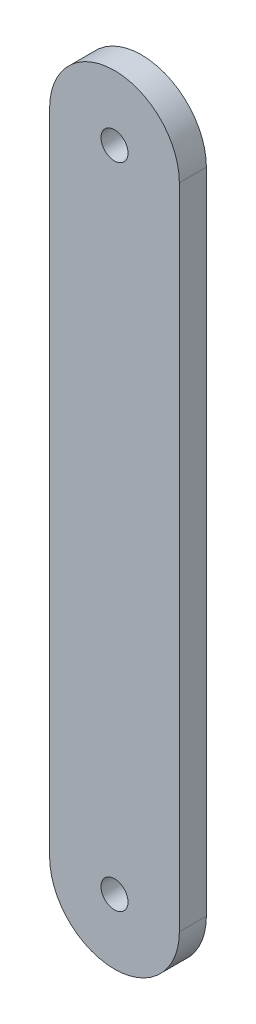
ISO-10303-21;
HEADER;
FILE_DESCRIPTION(('STEP AP214'),'2;1');
FILE_NAME('part.step','',(''),(''),'','','');
FILE_SCHEMA(('AUTOMOTIVE_DESIGN { 1 0 10303 214 1 1 1 1 }'));
ENDSEC;
DATA;
#1=APPLICATION_CONTEXT('core data for automotive mechanical design processes');
#2=APPLICATION_PROTOCOL_DEFINITION('international standard','automotive_design',2000,#1);
#3=PRODUCT_CONTEXT('',#1,'mechanical');
#4=PRODUCT('Part','Part','',(#3));
#5=PRODUCT_RELATED_PRODUCT_CATEGORY('part','',(#4));
#6=PRODUCT_DEFINITION_FORMATION('','',#4);
#7=PRODUCT_DEFINITION_CONTEXT('part definition',#1,'design');
#8=PRODUCT_DEFINITION('design','',#6,#7);
#9=PRODUCT_DEFINITION_SHAPE('','',#8);
#10=(LENGTH_UNIT() NAMED_UNIT(*) SI_UNIT(.MILLI.,.METRE.));
#11=(NAMED_UNIT(*) PLANE_ANGLE_UNIT() SI_UNIT($,.RADIAN.));
#12=(NAMED_UNIT(*) SI_UNIT($,.STERADIAN.) SOLID_ANGLE_UNIT());
#13=UNCERTAINTY_MEASURE_WITH_UNIT(LENGTH_MEASURE(1.E-05),#10,'distance_accuracy_value','');
#14=(GEOMETRIC_REPRESENTATION_CONTEXT(3) GLOBAL_UNCERTAINTY_ASSIGNED_CONTEXT((#13)) GLOBAL_UNIT_ASSIGNED_CONTEXT((#10,
#11,#12)) REPRESENTATION_CONTEXT('',''));
#15=CARTESIAN_POINT('',(0.,0.,0.));
#16=DIRECTION('',(0.,0.,1.));
#17=DIRECTION('',(1.,0.,0.));
#18=AXIS2_PLACEMENT_3D('',#15,#16,#17);
#19=CARTESIAN_POINT('',(0.,-60.0000000000001,0.));
#20=DIRECTION('',(0.,0.,1.));
#21=DIRECTION('',(1.,0.,0.));
#22=AXIS2_PLACEMENT_3D('',#19,#20,#21);
#23=CYLINDRICAL_SURFACE('',#22,12.);
#24=CARTESIAN_POINT('',(0.,-60.0000000000001,5.));
#25=DIRECTION('',(0.,0.,1.));
#26=DIRECTION('',(1.,0.,0.));
#27=AXIS2_PLACEMENT_3D('',#24,#25,#26);
#28=CIRCLE('',#27,12.);
#29=CARTESIAN_POINT('',(-12.,-60.0000000000001,5.));
#30=VERTEX_POINT('',#29);
#31=CARTESIAN_POINT('',(12.,-60.0000000000001,5.));
#32=VERTEX_POINT('',#31);
#33=EDGE_CURVE('E99',#30,#32,#28,.T.);
#34=ORIENTED_EDGE('',*,*,#33,.F.);
#35=DIRECTION('',(0.,0.,1.));
#36=VECTOR('',#35,1.);
#37=CARTESIAN_POINT('',(-12.,-60.0000000000001,0.));
#38=LINE('',#37,#36);
#39=CARTESIAN_POINT('',(-12.,-60.0000000000001,0.));
#40=VERTEX_POINT('',#39);
#41=EDGE_CURVE('E11',#40,#30,#38,.T.);
#42=ORIENTED_EDGE('',*,*,#41,.F.);
#43=CARTESIAN_POINT('',(0.,-60.0000000000001,0.));
#44=DIRECTION('',(0.,0.,1.));
#45=DIRECTION('',(1.,0.,0.));
#46=AXIS2_PLACEMENT_3D('',#43,#44,#45);
#47=CIRCLE('',#46,12.);
#48=CARTESIAN_POINT('',(12.,-60.0000000000001,0.));
#49=VERTEX_POINT('',#48);
#50=EDGE_CURVE('E92',#40,#49,#47,.T.);
#51=ORIENTED_EDGE('',*,*,#50,.T.);
#52=DIRECTION('',(0.,0.,1.));
#53=VECTOR('',#52,1.);
#54=CARTESIAN_POINT('',(12.,-60.0000000000001,0.));
#55=LINE('',#54,#53);
#56=EDGE_CURVE('E37',#49,#32,#55,.T.);
#57=ORIENTED_EDGE('',*,*,#56,.T.);
#58=EDGE_LOOP('',(#34,#42,#51,#57));
#59=FACE_BOUND('',#58,.T.);
#60=ADVANCED_FACE('F34',(#59),#23,.T.);
#61=CARTESIAN_POINT('',(-12.,60.0000000000001,0.));
#62=DIRECTION('',(-1.,0.,0.));
#63=DIRECTION('',(0.,0.,1.));
#64=AXIS2_PLACEMENT_3D('',#61,#62,#63);
#65=PLANE('',#64);
#66=DIRECTION('',(0.,-1.,0.));
#67=VECTOR('',#66,1.);
#68=CARTESIAN_POINT('',(-12.,60.0000000000001,5.));
#69=LINE('',#68,#67);
#70=CARTESIAN_POINT('',(-12.,60.0000000000001,5.));
#71=VERTEX_POINT('',#70);
#72=EDGE_CURVE('E94',#71,#30,#69,.T.);
#73=ORIENTED_EDGE('',*,*,#72,.F.);
#74=DIRECTION('',(0.,0.,1.));
#75=VECTOR('',#74,1.);
#76=CARTESIAN_POINT('',(-12.,60.0000000000001,0.));
#77=LINE('',#76,#75);
#78=CARTESIAN_POINT('',(-12.,60.0000000000001,0.));
#79=VERTEX_POINT('',#78);
#80=EDGE_CURVE('E43',#79,#71,#77,.T.);
#81=ORIENTED_EDGE('',*,*,#80,.F.);
#82=DIRECTION('',(0.,-1.,0.));
#83=VECTOR('',#82,1.);
#84=CARTESIAN_POINT('',(-12.,60.0000000000001,0.));
#85=LINE('',#84,#83);
#86=EDGE_CURVE('E89',#79,#40,#85,.T.);
#87=ORIENTED_EDGE('',*,*,#86,.T.);
#88=ORIENTED_EDGE('',*,*,#41,.T.);
#89=EDGE_LOOP('',(#73,#81,#87,#88));
#90=FACE_BOUND('',#89,.T.);
#91=ADVANCED_FACE('F110',(#90),#65,.T.);
#92=CARTESIAN_POINT('',(0.,60.0000000000001,0.));
#93=DIRECTION('',(0.,0.,1.));
#94=DIRECTION('',(1.,0.,0.));
#95=AXIS2_PLACEMENT_3D('',#92,#93,#94);
#96=CYLINDRICAL_SURFACE('',#95,12.);
#97=CARTESIAN_POINT('',(0.,60.0000000000001,5.));
#98=DIRECTION('',(0.,0.,1.));
#99=DIRECTION('',(1.,0.,0.));
#100=AXIS2_PLACEMENT_3D('',#97,#98,#99);
#101=CIRCLE('',#100,12.);
#102=CARTESIAN_POINT('',(12.,60.0000000000001,5.));
#103=VERTEX_POINT('',#102);
#104=EDGE_CURVE('E84',#103,#71,#101,.T.);
#105=ORIENTED_EDGE('',*,*,#104,.F.);
#106=DIRECTION('',(0.,0.,1.));
#107=VECTOR('',#106,1.);
#108=CARTESIAN_POINT('',(12.,60.0000000000001,0.));
#109=LINE('',#108,#107);
#110=CARTESIAN_POINT('',(12.,60.0000000000001,0.));
#111=VERTEX_POINT('',#110);
#112=EDGE_CURVE('E79',#111,#103,#109,.T.);
#113=ORIENTED_EDGE('',*,*,#112,.F.);
#114=CARTESIAN_POINT('',(0.,60.0000000000001,0.));
#115=DIRECTION('',(0.,0.,1.));
#116=DIRECTION('',(1.,0.,0.));
#117=AXIS2_PLACEMENT_3D('',#114,#115,#116);
#118=CIRCLE('',#117,12.);
#119=EDGE_CURVE('E82',#111,#79,#118,.T.);
#120=ORIENTED_EDGE('',*,*,#119,.T.);
#121=ORIENTED_EDGE('',*,*,#80,.T.);
#122=EDGE_LOOP('',(#105,#113,#120,#121));
#123=FACE_BOUND('',#122,.T.);
#124=ADVANCED_FACE('F81',(#123),#96,.T.);
#125=CARTESIAN_POINT('',(12.,-60.0000000000001,0.));
#126=DIRECTION('',(1.,0.,0.));
#127=DIRECTION('',(0.,1.,0.));
#128=AXIS2_PLACEMENT_3D('',#125,#126,#127);
#129=PLANE('',#128);
#130=DIRECTION('',(0.,1.,0.));
#131=VECTOR('',#130,1.);
#132=CARTESIAN_POINT('',(12.,-60.0000000000001,5.));
#133=LINE('',#132,#131);
#134=EDGE_CURVE('E102',#32,#103,#133,.T.);
#135=ORIENTED_EDGE('',*,*,#134,.F.);
#136=ORIENTED_EDGE('',*,*,#56,.F.);
#137=DIRECTION('',(0.,1.,0.));
#138=VECTOR('',#137,1.);
#139=CARTESIAN_POINT('',(12.,-60.0000000000001,0.));
#140=LINE('',#139,#138);
#141=EDGE_CURVE('E88',#49,#111,#140,.T.);
#142=ORIENTED_EDGE('',*,*,#141,.T.);
#143=ORIENTED_EDGE('',*,*,#112,.T.);
#144=EDGE_LOOP('',(#135,#136,#142,#143));
#145=FACE_BOUND('',#144,.T.);
#146=ADVANCED_FACE('F91',(#145),#129,.T.);
#147=CARTESIAN_POINT('',(0.,-60.0000000000001,0.));
#148=DIRECTION('',(0.,0.,1.));
#149=DIRECTION('',(1.,0.,0.));
#150=AXIS2_PLACEMENT_3D('',#147,#148,#149);
#151=PLANE('',#150);
#152=CARTESIAN_POINT('',(0.,60.0000000000001,0.));
#153=DIRECTION('',(0.,0.,1.));
#154=DIRECTION('',(-1.,0.,0.));
#155=AXIS2_PLACEMENT_3D('',#152,#153,#154);
#156=CIRCLE('',#155,2.5);
#157=CARTESIAN_POINT('',(-2.5,60.0000000000001,0.));
#158=VERTEX_POINT('',#157);
#159=EDGE_CURVE('E143',#158,#158,#156,.T.);
#160=ORIENTED_EDGE('',*,*,#159,.T.);
#161=EDGE_LOOP('',(#160));
#162=FACE_BOUND('',#161,.T.);
#163=CARTESIAN_POINT('',(0.,-60.0000000000001,0.));
#164=DIRECTION('',(0.,0.,1.));
#165=DIRECTION('',(-1.,0.,0.));
#166=AXIS2_PLACEMENT_3D('',#163,#164,#165);
#167=CIRCLE('',#166,2.5);
#168=CARTESIAN_POINT('',(-2.5,-60.0000000000001,0.));
#169=VERTEX_POINT('',#168);
#170=EDGE_CURVE('E103',#169,#169,#167,.T.);
#171=ORIENTED_EDGE('',*,*,#170,.T.);
#172=EDGE_LOOP('',(#171));
#173=FACE_BOUND('',#172,.T.);
#174=ORIENTED_EDGE('',*,*,#50,.F.);
#175=ORIENTED_EDGE('',*,*,#86,.F.);
#176=ORIENTED_EDGE('',*,*,#119,.F.);
#177=ORIENTED_EDGE('',*,*,#141,.F.);
#178=EDGE_LOOP('',(#174,#175,#176,#177));
#179=FACE_BOUND('',#178,.T.);
#180=ADVANCED_FACE('F87',(#162,#173,#179),#151,.F.);
#181=CARTESIAN_POINT('',(0.,-60.0000000000001,5.));
#182=DIRECTION('',(0.,0.,1.));
#183=DIRECTION('',(1.,0.,0.));
#184=AXIS2_PLACEMENT_3D('',#181,#182,#183);
#185=PLANE('',#184);
#186=CARTESIAN_POINT('',(0.,60.0000000000001,5.));
#187=DIRECTION('',(0.,0.,1.));
#188=DIRECTION('',(-1.,0.,0.));
#189=AXIS2_PLACEMENT_3D('',#186,#187,#188);
#190=CIRCLE('',#189,2.5);
#191=CARTESIAN_POINT('',(-2.5,60.0000000000001,5.));
#192=VERTEX_POINT('',#191);
#193=EDGE_CURVE('E146',#192,#192,#190,.T.);
#194=ORIENTED_EDGE('',*,*,#193,.F.);
#195=EDGE_LOOP('',(#194));
#196=FACE_BOUND('',#195,.T.);
#197=CARTESIAN_POINT('',(0.,-60.0000000000001,5.));
#198=DIRECTION('',(0.,0.,1.));
#199=DIRECTION('',(-1.,0.,0.));
#200=AXIS2_PLACEMENT_3D('',#197,#198,#199);
#201=CIRCLE('',#200,2.5);
#202=CARTESIAN_POINT('',(-2.5,-60.0000000000001,5.));
#203=VERTEX_POINT('',#202);
#204=EDGE_CURVE('E148',#203,#203,#201,.T.);
#205=ORIENTED_EDGE('',*,*,#204,.F.);
#206=EDGE_LOOP('',(#205));
#207=FACE_BOUND('',#206,.T.);
#208=ORIENTED_EDGE('',*,*,#33,.T.);
#209=ORIENTED_EDGE('',*,*,#134,.T.);
#210=ORIENTED_EDGE('',*,*,#104,.T.);
#211=ORIENTED_EDGE('',*,*,#72,.T.);
#212=EDGE_LOOP('',(#208,#209,#210,#211));
#213=FACE_BOUND('',#212,.T.);
#214=ADVANCED_FACE('F109',(#196,#207,#213),#185,.T.);
#215=CARTESIAN_POINT('',(0.,-60.0000000000001,0.));
#216=DIRECTION('',(0.,0.,1.));
#217=DIRECTION('',(1.,0.,0.));
#218=AXIS2_PLACEMENT_3D('',#215,#216,#217);
#219=CYLINDRICAL_SURFACE('',#218,2.5);
#220=ORIENTED_EDGE('',*,*,#170,.F.);
#221=EDGE_LOOP('',(#220));
#222=FACE_BOUND('',#221,.T.);
#223=ORIENTED_EDGE('',*,*,#204,.T.);
#224=EDGE_LOOP('',(#223));
#225=FACE_BOUND('',#224,.T.);
#226=ADVANCED_FACE('F128',(#222,#225),#219,.F.);
#227=CARTESIAN_POINT('',(0.,60.0000000000001,0.));
#228=DIRECTION('',(0.,0.,1.));
#229=DIRECTION('',(1.,0.,0.));
#230=AXIS2_PLACEMENT_3D('',#227,#228,#229);
#231=CYLINDRICAL_SURFACE('',#230,2.5);
#232=ORIENTED_EDGE('',*,*,#159,.F.);
#233=EDGE_LOOP('',(#232));
#234=FACE_BOUND('',#233,.T.);
#235=ORIENTED_EDGE('',*,*,#193,.T.);
#236=EDGE_LOOP('',(#235));
#237=FACE_BOUND('',#236,.T.);
#238=ADVANCED_FACE('F135',(#234,#237),#231,.F.);
#239=CLOSED_SHELL('',(#60,#91,#124,#146,#180,#214,#226,#238));
#240=MANIFOLD_SOLID_BREP('B2',#239);
#241=ADVANCED_BREP_SHAPE_REPRESENTATION('',(#18,#240),#14);
#242=SHAPE_DEFINITION_REPRESENTATION(#9,#241);
ENDSEC;
END-ISO-10303-21;
